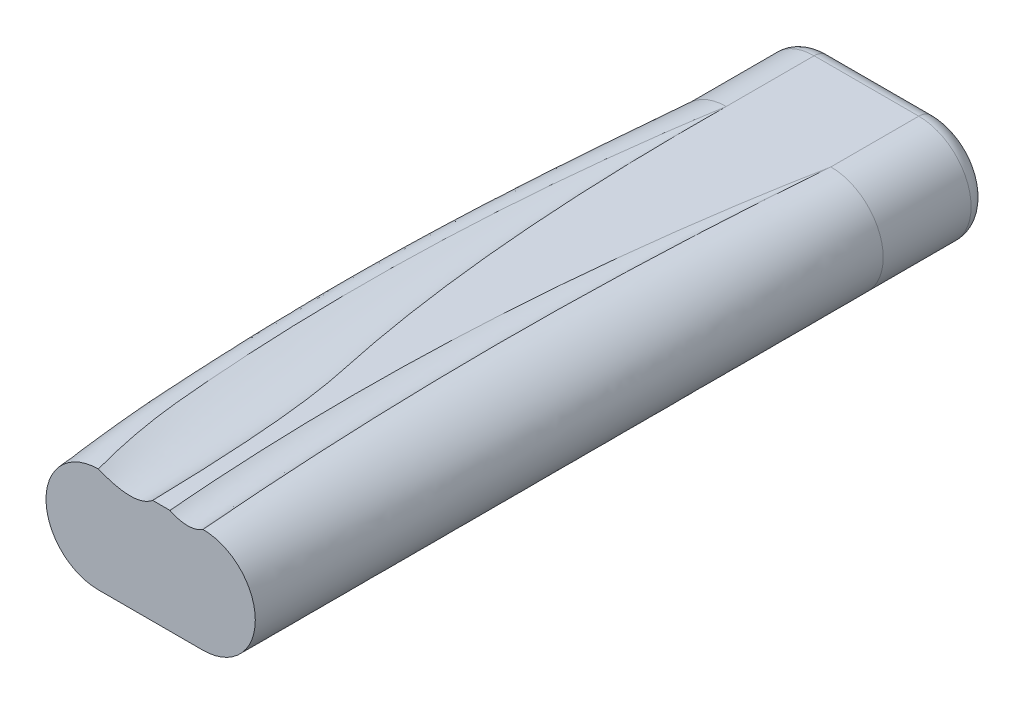
ISO-10303-21;
HEADER;
FILE_DESCRIPTION(('STEP AP214'),'2;1');
FILE_NAME('part.step','',(''),(''),'','','');
FILE_SCHEMA(('AUTOMOTIVE_DESIGN { 1 0 10303 214 1 1 1 1 }'));
ENDSEC;
DATA;
#1=APPLICATION_CONTEXT('core data for automotive mechanical design processes');
#2=APPLICATION_PROTOCOL_DEFINITION('international standard','automotive_design',2000,#1);
#3=PRODUCT_CONTEXT('',#1,'mechanical');
#4=PRODUCT('Part','Part','',(#3));
#5=PRODUCT_RELATED_PRODUCT_CATEGORY('part','',(#4));
#6=PRODUCT_DEFINITION_FORMATION('','',#4);
#7=PRODUCT_DEFINITION_CONTEXT('part definition',#1,'design');
#8=PRODUCT_DEFINITION('design','',#6,#7);
#9=PRODUCT_DEFINITION_SHAPE('','',#8);
#10=(LENGTH_UNIT() NAMED_UNIT(*) SI_UNIT(.MILLI.,.METRE.));
#11=(NAMED_UNIT(*) PLANE_ANGLE_UNIT() SI_UNIT($,.RADIAN.));
#12=(NAMED_UNIT(*) SI_UNIT($,.STERADIAN.) SOLID_ANGLE_UNIT());
#13=UNCERTAINTY_MEASURE_WITH_UNIT(LENGTH_MEASURE(1.E-05),#10,'distance_accuracy_value','');
#14=(GEOMETRIC_REPRESENTATION_CONTEXT(3) GLOBAL_UNCERTAINTY_ASSIGNED_CONTEXT((#13)) GLOBAL_UNIT_ASSIGNED_CONTEXT((#10,
#11,#12)) REPRESENTATION_CONTEXT('',''));
#15=CARTESIAN_POINT('',(0.,0.,0.));
#16=DIRECTION('',(0.,0.,1.));
#17=DIRECTION('',(1.,0.,0.));
#18=AXIS2_PLACEMENT_3D('',#15,#16,#17);
#19=CARTESIAN_POINT('',(-5.91221735905741,10.7831176583811,150.));
#20=DIRECTION('',(0.,0.,-1.));
#21=DIRECTION('',(-1.,0.,0.));
#22=AXIS2_PLACEMENT_3D('',#19,#20,#21);
#23=PLANE('',#22);
#24=CARTESIAN_POINT('',(0.474153099590674,12.5,150.));
#25=CARTESIAN_POINT('',(-3.21583822778807,9.48098458530452,150.));
#26=CARTESIAN_POINT('',(-8.54145909622858,10.9406625037117,150.));
#27=CARTESIAN_POINT('',(-12.5,12.5,150.));
#28=B_SPLINE_CURVE_WITH_KNOTS('',3,(#24,#25,#26,#27),.UNSPECIFIED.,.F.,.F.,(4,4),(0.,1.),.UNSPECIFIED.);
#29=CARTESIAN_POINT('',(0.474153099590674,12.5,150.));
#30=VERTEX_POINT('',#29);
#31=CARTESIAN_POINT('',(-12.5,12.5,150.));
#32=VERTEX_POINT('',#31);
#33=EDGE_CURVE('E255',#30,#32,#28,.T.);
#34=ORIENTED_EDGE('',*,*,#33,.T.);
#35=CARTESIAN_POINT('',(-12.5,0.,150.));
#36=DIRECTION('',(0.,0.,1.));
#37=DIRECTION('',(1.,0.,0.));
#38=AXIS2_PLACEMENT_3D('',#35,#36,#37);
#39=CIRCLE('',#38,12.5);
#40=CARTESIAN_POINT('',(-12.5,-12.5,150.));
#41=VERTEX_POINT('',#40);
#42=EDGE_CURVE('E286',#32,#41,#39,.T.);
#43=ORIENTED_EDGE('',*,*,#42,.T.);
#44=DIRECTION('',(1.,0.,0.));
#45=VECTOR('',#44,1.);
#46=CARTESIAN_POINT('',(-12.5,-12.5,150.));
#47=LINE('',#46,#45);
#48=CARTESIAN_POINT('',(12.5,-12.5,150.));
#49=VERTEX_POINT('',#48);
#50=EDGE_CURVE('E373',#41,#49,#47,.T.);
#51=ORIENTED_EDGE('',*,*,#50,.T.);
#52=CARTESIAN_POINT('',(12.5,0.,150.));
#53=DIRECTION('',(0.,0.,1.));
#54=DIRECTION('',(1.,0.,0.));
#55=AXIS2_PLACEMENT_3D('',#52,#53,#54);
#56=CIRCLE('',#55,12.5);
#57=CARTESIAN_POINT('',(12.5,12.5,150.));
#58=VERTEX_POINT('',#57);
#59=EDGE_CURVE('E363',#49,#58,#56,.T.);
#60=ORIENTED_EDGE('',*,*,#59,.T.);
#61=CARTESIAN_POINT('',(12.5,12.5,150.));
#62=CARTESIAN_POINT('',(10.190645501887,10.9194985123299,150.));
#63=CARTESIAN_POINT('',(6.97699935026828,11.2697294373195,150.));
#64=CARTESIAN_POINT('',(4.5992289890089,12.5,150.));
#65=B_SPLINE_CURVE_WITH_KNOTS('',3,(#61,#62,#63,#64),.UNSPECIFIED.,.F.,.F.,(4,4),(0.,1.),.UNSPECIFIED.);
#66=CARTESIAN_POINT('',(4.5992289890089,12.5,150.));
#67=VERTEX_POINT('',#66);
#68=EDGE_CURVE('E471',#58,#67,#65,.T.);
#69=ORIENTED_EDGE('',*,*,#68,.T.);
#70=DIRECTION('',(-1.,0.,0.));
#71=VECTOR('',#70,1.);
#72=CARTESIAN_POINT('',(0.474153099590674,12.5,150.));
#73=LINE('',#72,#71);
#74=EDGE_CURVE('E463',#67,#30,#73,.T.);
#75=ORIENTED_EDGE('',*,*,#74,.T.);
#76=EDGE_LOOP('',(#34,#43,#51,#60,#69,#75));
#77=FACE_BOUND('',#76,.T.);
#78=ADVANCED_FACE('F175',(#77),#23,.F.);
#79=CARTESIAN_POINT('',(12.5,12.5,150.));
#80=CARTESIAN_POINT('',(11.8126335312723,12.5,141.869479536742));
#81=CARTESIAN_POINT('',(11.2370034869234,12.5,133.73939089077));
#82=CARTESIAN_POINT('',(10.453008443718,12.5,120.000011036705));
#83=CARTESIAN_POINT('',(10.1861096601622,12.5,114.390493618579));
#84=CARTESIAN_POINT('',(8.59068550282614,12.5,72.5121919948681));
#85=CARTESIAN_POINT('',(9.43321433073099,12.5,36.2517980589654));
#86=CARTESIAN_POINT('',(12.5,12.5,0.));
#87=CARTESIAN_POINT('',(14.1362461630983,12.5,150.));
#88=CARTESIAN_POINT('',(13.4488796943706,12.5,141.869479536742));
#89=CARTESIAN_POINT('',(12.8732496500216,12.5,133.73939089077));
#90=CARTESIAN_POINT('',(12.0892546068163,12.5,120.000011036705));
#91=CARTESIAN_POINT('',(11.8223558232604,12.5,114.390493618579));
#92=CARTESIAN_POINT('',(10.2269316659244,12.5,72.5121919948681));
#93=CARTESIAN_POINT('',(11.0694604938293,12.5,36.2517980589654));
#94=CARTESIAN_POINT('',(14.1362461630983,12.5,0.));
#95=CARTESIAN_POINT('',(17.4082063041054,11.8498717823981,150.));
#96=CARTESIAN_POINT('',(16.8067606439687,11.8498717823981,141.869811586838));
#97=CARTESIAN_POINT('',(16.3030843551633,11.8498717823981,133.740001013801));
#98=CARTESIAN_POINT('',(15.6170886923586,11.8498717823981,120.000999888755));
#99=CARTESIAN_POINT('',(15.3835522567472,11.8498717823981,114.391611402969));
#100=CARTESIAN_POINT('',(13.9875561190782,11.8498717823981,72.5140804900332));
#101=CARTESIAN_POINT('',(14.724768843495,11.8498717823981,36.2532795488566));
#102=CARTESIAN_POINT('',(17.4082063041053,11.8498717823981,0.));
#103=CARTESIAN_POINT('',(21.5691455420025,9.06914554200246,150.));
#104=CARTESIAN_POINT('',(21.2254623076386,9.06914554200246,141.870807737125));
#105=CARTESIAN_POINT('',(20.9376472854642,9.06914554200246,133.741831382893));
#106=CARTESIAN_POINT('',(20.5456497638615,9.06914554200246,120.003966444907));
#107=CARTESIAN_POINT('',(20.4122003720835,9.06914554200246,114.394964756138));
#108=CARTESIAN_POINT('',(19.6144882934155,9.06914554200246,72.5197459755285));
#109=CARTESIAN_POINT('',(20.035752707368,9.06914554200246,36.25772401853));
#110=CARTESIAN_POINT('',(21.5691455420025,9.06914554200245,0.));
#111=CARTESIAN_POINT('',(24.3498717823981,4.90820630410531,150.));
#112=CARTESIAN_POINT('',(24.2639509738071,4.90820630410531,141.871803887412));
#113=CARTESIAN_POINT('',(24.1919972182635,4.90820630410531,133.743661751984));
#114=CARTESIAN_POINT('',(24.0939978378628,4.90820630410531,120.006933001059));
#115=CARTESIAN_POINT('',(24.0606354899184,4.90820630410531,114.398318109307));
#116=CARTESIAN_POINT('',(23.8612074702513,4.90820630410531,72.5254114610238));
#117=CARTESIAN_POINT('',(23.9665235737395,4.90820630410531,36.2621684882034));
#118=CARTESIAN_POINT('',(24.3498717823981,4.90820630410532,0.));
#119=CARTESIAN_POINT('',(25.,1.63624616309826,150.));
#120=CARTESIAN_POINT('',(25.,1.63624616309826,141.872135937508));
#121=CARTESIAN_POINT('',(25.,1.63624616309826,133.744271875015));
#122=CARTESIAN_POINT('',(25.,1.63624616309826,120.00792185311));
#123=CARTESIAN_POINT('',(25.,1.63624616309826,114.399435893697));
#124=CARTESIAN_POINT('',(25.,1.63624616309826,72.527299956189));
#125=CARTESIAN_POINT('',(25.,1.63624616309826,36.2636499780945));
#126=CARTESIAN_POINT('',(25.,1.63624616309826,0.));
#127=CARTESIAN_POINT('',(25.,-1.63624616309826,150.));
#128=CARTESIAN_POINT('',(25.,-1.63624616309826,141.872135937508));
#129=CARTESIAN_POINT('',(25.,-1.63624616309826,133.744271875015));
#130=CARTESIAN_POINT('',(25.,-1.63624616309826,120.00792185311));
#131=CARTESIAN_POINT('',(25.,-1.63624616309826,114.399435893697));
#132=CARTESIAN_POINT('',(25.,-1.63624616309826,72.527299956189));
#133=CARTESIAN_POINT('',(25.,-1.63624616309826,36.2636499780945));
#134=CARTESIAN_POINT('',(25.,-1.63624616309826,0.));
#135=CARTESIAN_POINT('',(24.3498717823982,-4.90820630410533,150.));
#136=CARTESIAN_POINT('',(24.3498717823982,-4.90820630410533,141.872135937508));
#137=CARTESIAN_POINT('',(24.3498717823982,-4.90820630410533,133.744271875015));
#138=CARTESIAN_POINT('',(24.3498717823981,-4.90820630410533,120.00792185311));
#139=CARTESIAN_POINT('',(24.3498717823981,-4.90820630410533,114.399435893697));
#140=CARTESIAN_POINT('',(24.3498717823981,-4.90820630410532,72.5272999561892));
#141=CARTESIAN_POINT('',(24.3498717823981,-4.90820630410532,36.2636499780946));
#142=CARTESIAN_POINT('',(24.3498717823981,-4.90820630410532,0.));
#143=CARTESIAN_POINT('',(21.5691455420024,-9.06914554200244,150.));
#144=CARTESIAN_POINT('',(21.5691455420024,-9.06914554200245,141.872135937507));
#145=CARTESIAN_POINT('',(21.5691455420024,-9.06914554200245,133.744271875015));
#146=CARTESIAN_POINT('',(21.5691455420024,-9.06914554200245,120.007921853109));
#147=CARTESIAN_POINT('',(21.5691455420024,-9.06914554200245,114.399435893696));
#148=CARTESIAN_POINT('',(21.5691455420024,-9.06914554200245,72.5272999561889));
#149=CARTESIAN_POINT('',(21.5691455420024,-9.06914554200246,36.2636499780944));
#150=CARTESIAN_POINT('',(21.5691455420025,-9.06914554200246,0.));
#151=CARTESIAN_POINT('',(17.4082063041054,-11.8498717823981,150.));
#152=CARTESIAN_POINT('',(17.4082063041054,-11.8498717823981,141.872135937508));
#153=CARTESIAN_POINT('',(17.4082063041054,-11.8498717823981,133.744271875015));
#154=CARTESIAN_POINT('',(17.4082063041053,-11.8498717823981,120.00792185311));
#155=CARTESIAN_POINT('',(17.4082063041053,-11.8498717823981,114.399435893697));
#156=CARTESIAN_POINT('',(17.4082063041053,-11.8498717823981,72.5272999561891));
#157=CARTESIAN_POINT('',(17.4082063041053,-11.8498717823981,36.2636499780945));
#158=CARTESIAN_POINT('',(17.4082063041053,-11.8498717823981,0.));
#159=CARTESIAN_POINT('',(14.1362461630983,-12.5,150.));
#160=CARTESIAN_POINT('',(14.1362461630983,-12.5,141.872135937508));
#161=CARTESIAN_POINT('',(14.1362461630983,-12.5,133.744271875015));
#162=CARTESIAN_POINT('',(14.1362461630983,-12.5,120.00792185311));
#163=CARTESIAN_POINT('',(14.1362461630983,-12.5,114.399435893697));
#164=CARTESIAN_POINT('',(14.1362461630983,-12.5,72.527299956189));
#165=CARTESIAN_POINT('',(14.1362461630983,-12.5,36.2636499780945));
#166=CARTESIAN_POINT('',(14.1362461630983,-12.5,0.));
#167=CARTESIAN_POINT('',(10.4166666666667,-12.5,150.));
#168=CARTESIAN_POINT('',(10.4166666666667,-12.5,141.872135937508));
#169=CARTESIAN_POINT('',(10.4166666666667,-12.5,133.744271875015));
#170=CARTESIAN_POINT('',(10.4166666666667,-12.5,120.00792185311));
#171=CARTESIAN_POINT('',(10.4166666666667,-12.5,114.399435893697));
#172=CARTESIAN_POINT('',(10.4166666666667,-12.5,72.527299956189));
#173=CARTESIAN_POINT('',(10.4166666666667,-12.5,36.2636499780945));
#174=CARTESIAN_POINT('',(10.4166666666667,-12.5,0.));
#175=CARTESIAN_POINT('',(6.25000000000001,-12.5,150.));
#176=CARTESIAN_POINT('',(6.25000000000001,-12.5,141.872135937508));
#177=CARTESIAN_POINT('',(6.25000000000001,-12.5,133.744271875015));
#178=CARTESIAN_POINT('',(6.25,-12.5,120.00792185311));
#179=CARTESIAN_POINT('',(6.25,-12.5,114.399435893697));
#180=CARTESIAN_POINT('',(6.25,-12.5,72.527299956189));
#181=CARTESIAN_POINT('',(6.25,-12.5,36.2636499780945));
#182=CARTESIAN_POINT('',(6.25,-12.5,0.));
#183=CARTESIAN_POINT('',(0.,-12.5,150.));
#184=CARTESIAN_POINT('',(0.,-12.5,141.872135937508));
#185=CARTESIAN_POINT('',(0.,-12.5,133.744271875015));
#186=CARTESIAN_POINT('',(0.,-12.5,120.00792185311));
#187=CARTESIAN_POINT('',(0.,-12.5,114.399435893697));
#188=CARTESIAN_POINT('',(0.,-12.5,72.5272999561891));
#189=CARTESIAN_POINT('',(0.,-12.5,36.2636499780945));
#190=CARTESIAN_POINT('',(0.,-12.5,0.));
#191=CARTESIAN_POINT('',(-6.25,-12.5,150.));
#192=CARTESIAN_POINT('',(-6.25,-12.5,141.872135937507));
#193=CARTESIAN_POINT('',(-6.25,-12.5,133.744271875015));
#194=CARTESIAN_POINT('',(-6.25,-12.5,120.00792185311));
#195=CARTESIAN_POINT('',(-6.25,-12.5,114.399435893696));
#196=CARTESIAN_POINT('',(-6.25,-12.5,72.527299956189));
#197=CARTESIAN_POINT('',(-6.25,-12.5,36.2636499780945));
#198=CARTESIAN_POINT('',(-6.24999999999999,-12.5,0.));
#199=CARTESIAN_POINT('',(-10.4166666666667,-12.5,150.));
#200=CARTESIAN_POINT('',(-10.4166666666667,-12.5,141.872135937508));
#201=CARTESIAN_POINT('',(-10.4166666666667,-12.5,133.744271875015));
#202=CARTESIAN_POINT('',(-10.4166666666667,-12.5,120.00792185311));
#203=CARTESIAN_POINT('',(-10.4166666666667,-12.5,114.399435893697));
#204=CARTESIAN_POINT('',(-10.4166666666667,-12.5,72.527299956189));
#205=CARTESIAN_POINT('',(-10.4166666666667,-12.5,36.2636499780945));
#206=CARTESIAN_POINT('',(-10.4166666666667,-12.5,0.));
#207=CARTESIAN_POINT('',(-14.1362461630983,-12.5,150.));
#208=CARTESIAN_POINT('',(-14.1362461630983,-12.5,141.872135937508));
#209=CARTESIAN_POINT('',(-14.1362461630983,-12.5,133.744271875015));
#210=CARTESIAN_POINT('',(-14.1362461630983,-12.5,120.00792185311));
#211=CARTESIAN_POINT('',(-14.1362461630983,-12.5,114.399435893697));
#212=CARTESIAN_POINT('',(-14.1362461630983,-12.5,72.527299956189));
#213=CARTESIAN_POINT('',(-14.1362461630983,-12.5,36.2636499780945));
#214=CARTESIAN_POINT('',(-14.1362461630983,-12.5,0.));
#215=CARTESIAN_POINT('',(-17.4082063041054,-11.8498717823981,150.));
#216=CARTESIAN_POINT('',(-17.4082063041054,-11.8498717823981,141.872135937508));
#217=CARTESIAN_POINT('',(-17.4082063041054,-11.8498717823981,133.744271875015));
#218=CARTESIAN_POINT('',(-17.4082063041054,-11.8498717823981,120.00792185311));
#219=CARTESIAN_POINT('',(-17.4082063041054,-11.8498717823981,114.399435893697));
#220=CARTESIAN_POINT('',(-17.4082063041053,-11.8498717823981,72.527299956189));
#221=CARTESIAN_POINT('',(-17.4082063041053,-11.8498717823981,36.2636499780945));
#222=CARTESIAN_POINT('',(-17.4082063041053,-11.8498717823981,0.));
#223=CARTESIAN_POINT('',(-21.5691455420024,-9.06914554200247,150.));
#224=CARTESIAN_POINT('',(-21.5691455420024,-9.06914554200247,141.872135937507));
#225=CARTESIAN_POINT('',(-21.5691455420024,-9.06914554200247,133.744271875015));
#226=CARTESIAN_POINT('',(-21.5691455420024,-9.06914554200247,120.007921853109));
#227=CARTESIAN_POINT('',(-21.5691455420024,-9.06914554200247,114.399435893696));
#228=CARTESIAN_POINT('',(-21.5691455420025,-9.06914554200247,72.5272999561889));
#229=CARTESIAN_POINT('',(-21.5691455420025,-9.06914554200246,36.2636499780945));
#230=CARTESIAN_POINT('',(-21.5691455420025,-9.06914554200246,0.));
#231=CARTESIAN_POINT('',(-24.3498717823981,-4.9082063041053,150.));
#232=CARTESIAN_POINT('',(-24.3498717823981,-4.9082063041053,141.872135937508));
#233=CARTESIAN_POINT('',(-24.3498717823981,-4.9082063041053,133.744271875015));
#234=CARTESIAN_POINT('',(-24.3498717823981,-4.9082063041053,120.00792185311));
#235=CARTESIAN_POINT('',(-24.3498717823981,-4.9082063041053,114.399435893697));
#236=CARTESIAN_POINT('',(-24.3498717823981,-4.90820630410531,72.5272999561891));
#237=CARTESIAN_POINT('',(-24.3498717823981,-4.90820630410531,36.2636499780945));
#238=CARTESIAN_POINT('',(-24.349871782398,-4.90820630410532,0.));
#239=CARTESIAN_POINT('',(-25.,-1.63624616309826,150.));
#240=CARTESIAN_POINT('',(-25.,-1.63624616309826,141.872135937508));
#241=CARTESIAN_POINT('',(-25.,-1.63624616309826,133.744271875015));
#242=CARTESIAN_POINT('',(-25.,-1.63624616309826,120.00792185311));
#243=CARTESIAN_POINT('',(-25.,-1.63624616309826,114.399435893697));
#244=CARTESIAN_POINT('',(-25.,-1.63624616309826,72.527299956189));
#245=CARTESIAN_POINT('',(-25.,-1.63624616309826,36.2636499780945));
#246=CARTESIAN_POINT('',(-25.,-1.63624616309826,0.));
#247=CARTESIAN_POINT('',(-25.,1.63624616309825,150.));
#248=CARTESIAN_POINT('',(-25.,1.63624616309825,141.872135937508));
#249=CARTESIAN_POINT('',(-25.,1.63624616309825,133.744271875015));
#250=CARTESIAN_POINT('',(-25.,1.63624616309825,120.00792185311));
#251=CARTESIAN_POINT('',(-25.,1.63624616309825,114.399435893697));
#252=CARTESIAN_POINT('',(-25.,1.63624616309826,72.527299956189));
#253=CARTESIAN_POINT('',(-25.,1.63624616309826,36.2636499780945));
#254=CARTESIAN_POINT('',(-25.,1.63624616309826,0.));
#255=CARTESIAN_POINT('',(-24.3498717823981,4.9082063041053,150.));
#256=CARTESIAN_POINT('',(-24.6336574691777,4.9082063041053,141.862781958882));
#257=CARTESIAN_POINT('',(-24.8222787925575,4.9082063041053,133.732727190063));
#258=CARTESIAN_POINT('',(-24.9802240416903,4.9082063041053,120.00478096357));
#259=CARTESIAN_POINT('',(-25.0326905544805,4.9082063041053,114.399305946857));
#260=CARTESIAN_POINT('',(-25.3346450416466,4.90820630410531,72.546511467878));
#261=CARTESIAN_POINT('',(-25.0935572054766,4.90820630410531,36.2820412534094));
#262=CARTESIAN_POINT('',(-24.3498717823981,4.90820630410532,0.));
#263=CARTESIAN_POINT('',(-21.5691455420024,9.06914554200247,150.));
#264=CARTESIAN_POINT('',(-22.7042882891208,9.06914554200247,141.834720023006));
#265=CARTESIAN_POINT('',(-23.4587735826399,9.06914554200247,133.698093135209));
#266=CARTESIAN_POINT('',(-24.0905545791711,9.06914554200247,119.995358294953));
#267=CARTESIAN_POINT('',(-24.300420630332,9.06914554200247,114.39891610634));
#268=CARTESIAN_POINT('',(-25.5082385789966,9.06914554200246,72.6041460029453));
#269=CARTESIAN_POINT('',(-24.5438872343166,9.06914554200246,36.3372150793542));
#270=CARTESIAN_POINT('',(-21.5691455420025,9.06914554200246,0.));
#271=CARTESIAN_POINT('',(-17.4082063041054,11.8498717823981,150.));
#272=CARTESIAN_POINT('',(-19.3947061115626,11.8498717823981,141.806658087129));
#273=CARTESIAN_POINT('',(-20.715055375221,11.8498717823981,133.663459080355));
#274=CARTESIAN_POINT('',(-21.8206721191506,11.8498717823981,119.985935626334));
#275=CARTESIAN_POINT('',(-22.1879377086821,11.8498717823981,114.398526265822));
#276=CARTESIAN_POINT('',(-24.3016191188451,11.8498717823981,72.6617805380124));
#277=CARTESIAN_POINT('',(-22.6140042656551,11.8498717823981,36.3923889052989));
#278=CARTESIAN_POINT('',(-17.4082063041053,11.8498717823981,0.));
#279=CARTESIAN_POINT('',(-14.1362461630983,12.5,150.));
#280=CARTESIAN_POINT('',(-16.4065316573351,12.5,141.797304108504));
#281=CARTESIAN_POINT('',(-17.9155022443733,12.5,133.651914395403));
#282=CARTESIAN_POINT('',(-19.1790642374356,12.5,119.982794736795));
#283=CARTESIAN_POINT('',(-19.5987963397574,12.5,114.398396318983));
#284=CARTESIAN_POINT('',(-22.0144322370865,12.5,72.6809920497015));
#285=CARTESIAN_POINT('',(-20.0857295477266,12.5,36.4107801806139));
#286=CARTESIAN_POINT('',(-14.1362461630983,12.5,0.));
#287=CARTESIAN_POINT('',(-12.5,12.5,150.));
#288=CARTESIAN_POINT('',(-14.7702854942368,12.5,141.797304108504));
#289=CARTESIAN_POINT('',(-16.2792560812751,12.5,133.651914395403));
#290=CARTESIAN_POINT('',(-17.5428180743374,12.5,119.982794736795));
#291=CARTESIAN_POINT('',(-17.9625501766591,12.5,114.398396318983));
#292=CARTESIAN_POINT('',(-20.3781860739883,12.5,72.6809920497015));
#293=CARTESIAN_POINT('',(-18.4494833846283,12.5,36.4107801806139));
#294=CARTESIAN_POINT('',(-12.5,12.5,0.));
#295=B_SPLINE_SURFACE_WITH_KNOTS('',3,3,((#79,#80,#81,#82,#83,#84,#85,#86),(#87,#88,#89,#90,#91,
#92,#93,#94),(#95,#96,#97,#98,#99,#100,#101,#102),(#103,#104,#105,#106,#107,#108,#109,#110),
(#111,#112,#113,#114,#115,#116,#117,#118),(#119,#120,#121,#122,#123,#124,#125,#126),(#127,#128,
#129,#130,#131,#132,#133,#134),(#135,#136,#137,#138,#139,#140,#141,#142),(#143,#144,#145,#146,
#147,#148,#149,#150),(#151,#152,#153,#154,#155,#156,#157,#158),(#159,#160,#161,#162,#163,#164,
#165,#166),(#167,#168,#169,#170,#171,#172,#173,#174),(#175,#176,#177,#178,#179,#180,#181,#182),
(#183,#184,#185,#186,#187,#188,#189,#190),(#191,#192,#193,#194,#195,#196,#197,#198),(#199,#200,
#201,#202,#203,#204,#205,#206),(#207,#208,#209,#210,#211,#212,#213,#214),(#215,#216,#217,#218,
#219,#220,#221,#222),(#223,#224,#225,#226,#227,#228,#229,#230),(#231,#232,#233,#234,#235,#236,
#237,#238),(#239,#240,#241,#242,#243,#244,#245,#246),(#247,#248,#249,#250,#251,#252,#253,#254),
(#255,#256,#257,#258,#259,#260,#261,#262),(#263,#264,#265,#266,#267,#268,#269,#270),(#271,#272,
#273,#274,#275,#276,#277,#278),(#279,#280,#281,#282,#283,#284,#285,#286),(#287,#288,#289,#290,
#291,#292,#293,#294)),.UNSPECIFIED.,.F.,.F.,.F.,(4,1,1,1,2,1,1,1,2,1,1,1,2,1,1,1,2,1,1,1,4),(4,
2,2,4),(0.,0.0474091870621735,0.094818374124347,0.142227561186521,0.189636748248694,
0.237045935310867,0.284455122373041,0.331864309435215,0.379273496497388,0.439636748248694,0.5,
0.560363251751306,0.620726503502612,0.668135690564786,0.715544877626959,0.762954064689133,
0.810363251751306,0.85777243881348,0.905181625875653,0.952590812937827,1.),(0.,
0.162557281249849,0.27472700043811,1.),.UNSPECIFIED.);
#296=CARTESIAN_POINT('',(-12.5,12.5,150.));
#297=CARTESIAN_POINT('',(-14.7702854942368,12.5,141.797304108504));
#298=CARTESIAN_POINT('',(-16.2792560812751,12.5,133.651914395403));
#299=CARTESIAN_POINT('',(-17.5428180743374,12.5,119.982794736795));
#300=CARTESIAN_POINT('',(-17.9625501766591,12.5,114.398396318983));
#301=CARTESIAN_POINT('',(-20.3781860739883,12.5,72.6809920497015));
#302=CARTESIAN_POINT('',(-18.4494833846283,12.5,36.4107801806139));
#303=CARTESIAN_POINT('',(-12.5,12.5,0.));
#304=B_SPLINE_CURVE_WITH_KNOTS('',3,(#296,#297,#298,#299,#300,#301,#302,#303),.UNSPECIFIED.,.F.,
.F.,(4,2,2,4),(0.,0.162557281249849,0.27472700043811,1.),.UNSPECIFIED.);
#305=CARTESIAN_POINT('',(-12.5,12.5,0.));
#306=VERTEX_POINT('',#305);
#307=EDGE_CURVE('E277',#32,#306,#304,.T.);
#308=CARTESIAN_POINT('',(-12.5,0.,0.));
#309=DIRECTION('',(0.,0.,1.));
#310=DIRECTION('',(1.,0.,0.));
#311=AXIS2_PLACEMENT_3D('',#308,#309,#310);
#312=CIRCLE('',#311,12.5);
#313=CARTESIAN_POINT('',(-12.5,-12.5,0.));
#314=VERTEX_POINT('',#313);
#315=EDGE_CURVE('E259',#306,#314,#312,.T.);
#316=DIRECTION('',(1.,0.,0.));
#317=VECTOR('',#316,1.);
#318=CARTESIAN_POINT('',(-12.5,-12.5,0.));
#319=LINE('',#318,#317);
#320=CARTESIAN_POINT('',(12.5,-12.5,0.));
#321=VERTEX_POINT('',#320);
#322=EDGE_CURVE('E270',#314,#321,#319,.T.);
#323=CARTESIAN_POINT('',(12.5,0.,0.));
#324=DIRECTION('',(0.,0.,1.));
#325=DIRECTION('',(1.,0.,0.));
#326=AXIS2_PLACEMENT_3D('',#323,#324,#325);
#327=CIRCLE('',#326,12.5);
#328=CARTESIAN_POINT('',(12.5,12.5,0.));
#329=VERTEX_POINT('',#328);
#330=EDGE_CURVE('E385',#321,#329,#327,.T.);
#331=CARTESIAN_POINT('',(12.5,12.5,150.));
#332=CARTESIAN_POINT('',(11.8126335312723,12.5,141.869479536742));
#333=CARTESIAN_POINT('',(11.2370034869234,12.5,133.73939089077));
#334=CARTESIAN_POINT('',(10.453008443718,12.5,120.000011036705));
#335=CARTESIAN_POINT('',(10.1861096601622,12.5,114.390493618579));
#336=CARTESIAN_POINT('',(8.59068550282614,12.5,72.5121919948681));
#337=CARTESIAN_POINT('',(9.43321433073099,12.5,36.2517980589654));
#338=CARTESIAN_POINT('',(12.5,12.5,0.));
#339=B_SPLINE_CURVE_WITH_KNOTS('',3,(#331,#332,#333,#334,#335,#336,#337,#338),.UNSPECIFIED.,.F.,
.F.,(4,2,2,4),(0.,0.162557281249849,0.27472700043811,1.),.UNSPECIFIED.);
#340=EDGE_CURVE('E289',#329,#58,#339,.F.);
#341=ORIENTED_EDGE('',*,*,#59,.F.);
#342=ORIENTED_EDGE('',*,*,#50,.F.);
#343=ORIENTED_EDGE('',*,*,#42,.F.);
#344=ORIENTED_EDGE('',*,*,#307,.T.);
#345=ORIENTED_EDGE('',*,*,#315,.T.);
#346=ORIENTED_EDGE('',*,*,#322,.T.);
#347=ORIENTED_EDGE('',*,*,#330,.T.);
#348=ORIENTED_EDGE('',*,*,#340,.T.);
#349=EDGE_LOOP('',(#341,#342,#343,#344,#345,#346,#347,#348));
#350=FACE_BOUND('',#349,.T.);
#351=ADVANCED_FACE('F284',(#350),#295,.T.);
#352=CARTESIAN_POINT('',(-12.5,12.5,150.));
#353=CARTESIAN_POINT('',(-14.7702854942368,12.5,141.797304108504));
#354=CARTESIAN_POINT('',(-16.2792560812751,12.5,133.651914395403));
#355=CARTESIAN_POINT('',(-17.5428180743374,12.5,119.982794736795));
#356=CARTESIAN_POINT('',(-17.9625501766591,12.5,114.398396318983));
#357=CARTESIAN_POINT('',(-20.3781860739883,12.5,72.6809920497015));
#358=CARTESIAN_POINT('',(-18.4494833846283,12.5,36.4107801806139));
#359=CARTESIAN_POINT('',(-12.5,12.5,0.));
#360=CARTESIAN_POINT('',(-8.54145909622858,10.9406625037117,150.));
#361=CARTESIAN_POINT('',(-10.1279877750606,11.0251563916942,140.126008887534));
#362=CARTESIAN_POINT('',(-11.3165153367196,11.1096502796767,130.968502540173));
#363=CARTESIAN_POINT('',(-12.65253029213,11.2524476506854,116.702906301747));
#364=CARTESIAN_POINT('',(-13.1860605133687,11.3107511337115,111.199049446895));
#365=CARTESIAN_POINT('',(-17.0800402749695,11.7460364111584,72.5024913021036));
#366=CARTESIAN_POINT('',(-16.6774961266623,12.1230182055792,37.1638545043174));
#367=CARTESIAN_POINT('',(-12.5,12.5,0.));
#368=CARTESIAN_POINT('',(-3.21583822778807,9.48098458530452,150.));
#369=CARTESIAN_POINT('',(-4.19268635865118,9.64457223125929,138.454713666565));
#370=CARTESIAN_POINT('',(-5.13484716236691,9.80815987721405,128.285090684943));
#371=CARTESIAN_POINT('',(-6.66850633947622,10.0846282269326,113.4230178667));
#372=CARTESIAN_POINT('',(-7.3669496715468,10.1975089306964,107.999702574806));
#373=CARTESIAN_POINT('',(-13.1208903515398,11.0402597563068,72.3239905545057));
#374=CARTESIAN_POINT('',(-14.5750068064908,11.7701298781534,37.916928828021));
#375=CARTESIAN_POINT('',(-12.5,12.5,0.));
#376=CARTESIAN_POINT('',(0.474153099590674,12.5,150.));
#377=CARTESIAN_POINT('',(0.195613347138788,12.5,136.783418445595));
#378=CARTESIAN_POINT('',(-0.411552868191351,12.5,125.601678829713));
#379=CARTESIAN_POINT('',(-1.99307240111831,12.5,110.143129431652));
#380=CARTESIAN_POINT('',(-2.7952728085818,12.5,104.800355702717));
#381=CARTESIAN_POINT('',(-9.9525923903886,12.5,72.1454898069077));
#382=CARTESIAN_POINT('',(-12.8679434674585,12.5,38.6700031517245));
#383=CARTESIAN_POINT('',(-12.5,12.5,0.));
#384=B_SPLINE_SURFACE_WITH_KNOTS('',3,3,((#352,#353,#354,#355,#356,#357,#358,#359),(#360,#361,
#362,#363,#364,#365,#366,#367),(#368,#369,#370,#371,#372,#373,#374,#375),(#376,#377,#378,#379,
#380,#381,#382,#383)),.UNSPECIFIED.,.F.,.F.,.F.,(4,4),(4,2,2,4),(0.,1.),(0.,0.162557281249849,
0.27472700043811,1.),.UNSPECIFIED.);
#385=CARTESIAN_POINT('',(0.474153099590674,12.5,150.));
#386=CARTESIAN_POINT('',(0.195613347138788,12.5,136.783418445595));
#387=CARTESIAN_POINT('',(-0.411552868191351,12.5,125.601678829713));
#388=CARTESIAN_POINT('',(-1.99307240111831,12.5,110.143129431652));
#389=CARTESIAN_POINT('',(-2.7952728085818,12.5,104.800355702717));
#390=CARTESIAN_POINT('',(-9.9525923903886,12.5,72.1454898069077));
#391=CARTESIAN_POINT('',(-12.8679434674585,12.5,38.6700031517245));
#392=CARTESIAN_POINT('',(-12.5,12.5,0.));
#393=B_SPLINE_CURVE_WITH_KNOTS('',3,(#385,#386,#387,#388,#389,#390,#391,#392),.UNSPECIFIED.,.F.,
.F.,(4,2,2,4),(0.,0.162557281249849,0.27472700043811,1.),.UNSPECIFIED.);
#394=EDGE_CURVE('E251',#30,#306,#393,.T.);
#395=ORIENTED_EDGE('',*,*,#33,.F.);
#396=ORIENTED_EDGE('',*,*,#394,.T.);
#397=ORIENTED_EDGE('',*,*,#307,.F.);
#398=EDGE_LOOP('',(#395,#396,#397));
#399=FACE_BOUND('',#398,.T.);
#400=ADVANCED_FACE('F276',(#399),#384,.T.);
#401=CARTESIAN_POINT('',(4.5992289890089,12.5,150.));
#402=CARTESIAN_POINT('',(3.9118519532207,12.5,141.818554304135));
#403=CARTESIAN_POINT('',(3.4058053410288,12.5,133.645818692917));
#404=CARTESIAN_POINT('',(2.85702460478204,12.5,119.848354641041));
#405=CARTESIAN_POINT('',(2.71929946921701,12.5,114.219063371188));
#406=CARTESIAN_POINT('',(2.33566117283438,12.5,72.2225608313498));
#407=CARTESIAN_POINT('',(5.61302325758834,12.5,36.0245877124215));
#408=CARTESIAN_POINT('',(12.5,12.5,0.));
#409=CARTESIAN_POINT('',(6.97699935026828,11.2697294373195,150.));
#410=CARTESIAN_POINT('',(6.3034876367487,11.3363925832765,141.835529381671));
#411=CARTESIAN_POINT('',(5.78810834708622,11.4030557292336,133.677009425535));
#412=CARTESIAN_POINT('',(5.18434972671545,11.5157185763711,119.898906772929));
#413=CARTESIAN_POINT('',(5.01313179343389,11.5617182775515,114.276206786985));
#414=CARTESIAN_POINT('',(4.29697640206424,11.9051453191547,72.3191045525225));
#415=CARTESIAN_POINT('',(6.82457384158553,12.2025726595773,36.1003244946028));
#416=CARTESIAN_POINT('',(12.5,12.5,0.));
#417=CARTESIAN_POINT('',(10.190645501887,10.9194985123299,150.));
#418=CARTESIAN_POINT('',(9.48570654532156,11.0051391872789,141.852504459207));
#419=CARTESIAN_POINT('',(8.91570201287402,11.0907798622279,133.708200158153));
#420=CARTESIAN_POINT('',(8.18041962550451,11.2355153398598,119.949458904817));
#421=CARTESIAN_POINT('',(7.94445557694612,11.2946101425426,114.333350202782));
#422=CARTESIAN_POINT('',(6.66245039245081,11.735803296817,72.4156482736953));
#423=CARTESIAN_POINT('',(8.23820380616107,12.1179016484085,36.1760612767841));
#424=CARTESIAN_POINT('',(12.5,12.5,0.));
#425=CARTESIAN_POINT('',(12.5,12.5,150.));
#426=CARTESIAN_POINT('',(11.8126335312723,12.5,141.869479536742));
#427=CARTESIAN_POINT('',(11.2370034869234,12.5,133.73939089077));
#428=CARTESIAN_POINT('',(10.453008443718,12.5,120.000011036705));
#429=CARTESIAN_POINT('',(10.1861096601622,12.5,114.390493618579));
#430=CARTESIAN_POINT('',(8.59068550282614,12.5,72.5121919948681));
#431=CARTESIAN_POINT('',(9.43321433073099,12.5,36.2517980589654));
#432=CARTESIAN_POINT('',(12.5,12.5,0.));
#433=B_SPLINE_SURFACE_WITH_KNOTS('',3,3,((#401,#402,#403,#404,#405,#406,#407,#408),(#409,#410,
#411,#412,#413,#414,#415,#416),(#417,#418,#419,#420,#421,#422,#423,#424),(#425,#426,#427,#428,
#429,#430,#431,#432)),.UNSPECIFIED.,.F.,.F.,.F.,(4,4),(4,2,2,4),(0.,1.),(0.,0.162557281249849,
0.27472700043811,1.),.UNSPECIFIED.);
#434=CARTESIAN_POINT('',(4.5992289890089,12.5,150.));
#435=CARTESIAN_POINT('',(3.9118519532207,12.5,141.818554304135));
#436=CARTESIAN_POINT('',(3.4058053410288,12.5,133.645818692917));
#437=CARTESIAN_POINT('',(2.85702460478204,12.5,119.848354641041));
#438=CARTESIAN_POINT('',(2.71929946921701,12.5,114.219063371188));
#439=CARTESIAN_POINT('',(2.33566117283438,12.5,72.2225608313498));
#440=CARTESIAN_POINT('',(5.61302325758834,12.5,36.0245877124215));
#441=CARTESIAN_POINT('',(12.5,12.5,0.));
#442=B_SPLINE_CURVE_WITH_KNOTS('',3,(#434,#435,#436,#437,#438,#439,#440,#441),.UNSPECIFIED.,.F.,
.F.,(4,2,2,4),(0.,0.162557281249849,0.27472700043811,1.),.UNSPECIFIED.);
#443=EDGE_CURVE('E271',#67,#329,#442,.T.);
#444=ORIENTED_EDGE('',*,*,#68,.F.);
#445=ORIENTED_EDGE('',*,*,#340,.F.);
#446=ORIENTED_EDGE('',*,*,#443,.F.);
#447=EDGE_LOOP('',(#444,#445,#446));
#448=FACE_BOUND('',#447,.T.);
#449=ADVANCED_FACE('F320',(#448),#433,.T.);
#450=CARTESIAN_POINT('',(0.474153099590674,12.5,150.));
#451=DIRECTION('',(0.,1.,0.));
#452=DIRECTION('',(1.,0.,0.));
#453=AXIS2_PLACEMENT_3D('',#450,#451,#452);
#454=PLANE('',#453);
#455=DIRECTION('',(0.,0.,1.));
#456=VECTOR('',#455,1.);
#457=CARTESIAN_POINT('',(12.5,12.5,-25.));
#458=LINE('',#457,#456);
#459=CARTESIAN_POINT('',(12.5,12.5,-21.));
#460=VERTEX_POINT('',#459);
#461=EDGE_CURVE('E256',#460,#329,#458,.T.);
#462=ORIENTED_EDGE('',*,*,#461,.F.);
#463=DIRECTION('',(1.,0.,0.));
#464=VECTOR('',#463,1.);
#465=CARTESIAN_POINT('',(0.474153099590674,12.5,-21.));
#466=LINE('',#465,#464);
#467=CARTESIAN_POINT('',(-12.5,12.5,-21.));
#468=VERTEX_POINT('',#467);
#469=EDGE_CURVE('E185',#460,#468,#466,.F.);
#470=ORIENTED_EDGE('',*,*,#469,.T.);
#471=DIRECTION('',(0.,0.,1.));
#472=VECTOR('',#471,1.);
#473=CARTESIAN_POINT('',(-12.5,12.5,-25.));
#474=LINE('',#473,#472);
#475=EDGE_CURVE('E246',#468,#306,#474,.T.);
#476=ORIENTED_EDGE('',*,*,#475,.T.);
#477=ORIENTED_EDGE('',*,*,#394,.F.);
#478=ORIENTED_EDGE('',*,*,#74,.F.);
#479=ORIENTED_EDGE('',*,*,#443,.T.);
#480=EDGE_LOOP('',(#462,#470,#476,#477,#478,#479));
#481=FACE_BOUND('',#480,.T.);
#482=ADVANCED_FACE('F248',(#481),#454,.T.);
#483=CARTESIAN_POINT('',(-12.5,0.,-25.));
#484=DIRECTION('',(0.,0.,1.));
#485=DIRECTION('',(1.,0.,0.));
#486=AXIS2_PLACEMENT_3D('',#483,#484,#485);
#487=CYLINDRICAL_SURFACE('',#486,12.5);
#488=ORIENTED_EDGE('',*,*,#475,.F.);
#489=CARTESIAN_POINT('',(-12.5,0.,-21.));
#490=DIRECTION('',(0.,0.,-1.));
#491=DIRECTION('',(-1.,0.,0.));
#492=AXIS2_PLACEMENT_3D('',#489,#490,#491);
#493=CIRCLE('',#492,12.5);
#494=CARTESIAN_POINT('',(-12.5,-12.5,-21.));
#495=VERTEX_POINT('',#494);
#496=EDGE_CURVE('E13',#468,#495,#493,.F.);
#497=ORIENTED_EDGE('',*,*,#496,.T.);
#498=DIRECTION('',(0.,0.,1.));
#499=VECTOR('',#498,1.);
#500=CARTESIAN_POINT('',(-12.5,-12.5,-25.));
#501=LINE('',#500,#499);
#502=EDGE_CURVE('E263',#495,#314,#501,.T.);
#503=ORIENTED_EDGE('',*,*,#502,.T.);
#504=ORIENTED_EDGE('',*,*,#315,.F.);
#505=EDGE_LOOP('',(#488,#497,#503,#504));
#506=FACE_BOUND('',#505,.T.);
#507=ADVANCED_FACE('F261',(#506),#487,.T.);
#508=CARTESIAN_POINT('',(12.5,0.,-25.));
#509=DIRECTION('',(0.,0.,1.));
#510=DIRECTION('',(1.,0.,0.));
#511=AXIS2_PLACEMENT_3D('',#508,#509,#510);
#512=CYLINDRICAL_SURFACE('',#511,12.5);
#513=DIRECTION('',(0.,0.,1.));
#514=VECTOR('',#513,1.);
#515=CARTESIAN_POINT('',(12.5,-12.5,-25.));
#516=LINE('',#515,#514);
#517=CARTESIAN_POINT('',(12.5,-12.5,-21.));
#518=VERTEX_POINT('',#517);
#519=EDGE_CURVE('E545',#518,#321,#516,.T.);
#520=ORIENTED_EDGE('',*,*,#519,.F.);
#521=CARTESIAN_POINT('',(12.5,0.,-21.));
#522=DIRECTION('',(0.,0.,-1.));
#523=DIRECTION('',(-1.,0.,0.));
#524=AXIS2_PLACEMENT_3D('',#521,#522,#523);
#525=CIRCLE('',#524,12.5);
#526=EDGE_CURVE('E200',#518,#460,#525,.F.);
#527=ORIENTED_EDGE('',*,*,#526,.T.);
#528=ORIENTED_EDGE('',*,*,#461,.T.);
#529=ORIENTED_EDGE('',*,*,#330,.F.);
#530=EDGE_LOOP('',(#520,#527,#528,#529));
#531=FACE_BOUND('',#530,.T.);
#532=ADVANCED_FACE('F561',(#531),#512,.T.);
#533=CARTESIAN_POINT('',(-12.5,-12.5,-25.));
#534=DIRECTION('',(0.,1.,0.));
#535=DIRECTION('',(-1.,0.,0.));
#536=AXIS2_PLACEMENT_3D('',#533,#534,#535);
#537=PLANE('',#536);
#538=ORIENTED_EDGE('',*,*,#502,.F.);
#539=DIRECTION('',(-1.,0.,0.));
#540=VECTOR('',#539,1.);
#541=CARTESIAN_POINT('',(12.5,-12.5,-21.));
#542=LINE('',#541,#540);
#543=EDGE_CURVE('E518',#495,#518,#542,.F.);
#544=ORIENTED_EDGE('',*,*,#543,.T.);
#545=ORIENTED_EDGE('',*,*,#519,.T.);
#546=ORIENTED_EDGE('',*,*,#322,.F.);
#547=EDGE_LOOP('',(#538,#544,#545,#546));
#548=FACE_BOUND('',#547,.T.);
#549=ADVANCED_FACE('F570',(#548),#537,.F.);
#550=CARTESIAN_POINT('',(-12.5,0.,-25.));
#551=DIRECTION('',(0.,0.,-1.));
#552=DIRECTION('',(-1.,0.,0.));
#553=AXIS2_PLACEMENT_3D('',#550,#551,#552);
#554=PLANE('',#553);
#555=CARTESIAN_POINT('',(12.5,0.,-25.));
#556=DIRECTION('',(0.,0.,-1.));
#557=DIRECTION('',(-1.,0.,0.));
#558=AXIS2_PLACEMENT_3D('',#555,#556,#557);
#559=CIRCLE('',#558,8.5);
#560=CARTESIAN_POINT('',(12.5,8.5,-25.));
#561=VERTEX_POINT('',#560);
#562=CARTESIAN_POINT('',(12.5,-8.5,-25.));
#563=VERTEX_POINT('',#562);
#564=EDGE_CURVE('E511',#561,#563,#559,.T.);
#565=ORIENTED_EDGE('',*,*,#564,.T.);
#566=DIRECTION('',(-1.,0.,0.));
#567=VECTOR('',#566,1.);
#568=CARTESIAN_POINT('',(-12.5,-8.5,-25.));
#569=LINE('',#568,#567);
#570=CARTESIAN_POINT('',(-12.5,-8.49999999999999,-25.));
#571=VERTEX_POINT('',#570);
#572=EDGE_CURVE('E514',#563,#571,#569,.T.);
#573=ORIENTED_EDGE('',*,*,#572,.T.);
#574=CARTESIAN_POINT('',(-12.5,0.,-25.));
#575=DIRECTION('',(0.,0.,-1.));
#576=DIRECTION('',(-1.,0.,0.));
#577=AXIS2_PLACEMENT_3D('',#574,#575,#576);
#578=CIRCLE('',#577,8.5);
#579=CARTESIAN_POINT('',(-12.5,8.50000000000001,-25.));
#580=VERTEX_POINT('',#579);
#581=EDGE_CURVE('E505',#571,#580,#578,.T.);
#582=ORIENTED_EDGE('',*,*,#581,.T.);
#583=DIRECTION('',(1.,0.,0.));
#584=VECTOR('',#583,1.);
#585=CARTESIAN_POINT('',(-12.5,8.5,-25.));
#586=LINE('',#585,#584);
#587=EDGE_CURVE('E508',#580,#561,#586,.T.);
#588=ORIENTED_EDGE('',*,*,#587,.T.);
#589=EDGE_LOOP('',(#565,#573,#582,#588));
#590=FACE_BOUND('',#589,.T.);
#591=ADVANCED_FACE('F574',(#590),#554,.T.);
#592=CARTESIAN_POINT('',(-12.5,8.5,-21.));
#593=DIRECTION('',(1.,0.,0.));
#594=DIRECTION('',(0.,0.,-1.));
#595=AXIS2_PLACEMENT_3D('',#592,#593,#594);
#596=CYLINDRICAL_SURFACE('',#595,4.);
#597=CARTESIAN_POINT('',(-12.5,8.5,-21.));
#598=DIRECTION('',(-1.,0.,0.));
#599=DIRECTION('',(0.,0.,1.));
#600=AXIS2_PLACEMENT_3D('',#597,#598,#599);
#601=CIRCLE('',#600,4.);
#602=EDGE_CURVE('E533',#468,#580,#601,.T.);
#603=ORIENTED_EDGE('',*,*,#602,.F.);
#604=ORIENTED_EDGE('',*,*,#469,.F.);
#605=CARTESIAN_POINT('',(12.5,8.5,-21.));
#606=DIRECTION('',(1.,0.,0.));
#607=DIRECTION('',(0.,1.,0.));
#608=AXIS2_PLACEMENT_3D('',#605,#606,#607);
#609=CIRCLE('',#608,4.);
#610=EDGE_CURVE('E179',#561,#460,#609,.T.);
#611=ORIENTED_EDGE('',*,*,#610,.F.);
#612=ORIENTED_EDGE('',*,*,#587,.F.);
#613=EDGE_LOOP('',(#603,#604,#611,#612));
#614=FACE_BOUND('',#613,.T.);
#615=ADVANCED_FACE('F177',(#614),#596,.T.);
#616=CARTESIAN_POINT('',(12.5,0.,-21.));
#617=DIRECTION('',(0.,0.,-1.));
#618=DIRECTION('',(-1.,0.,0.));
#619=AXIS2_PLACEMENT_3D('',#616,#617,#618);
#620=TOROIDAL_SURFACE('',#619,8.5,4.);
#621=ORIENTED_EDGE('',*,*,#610,.T.);
#622=ORIENTED_EDGE('',*,*,#526,.F.);
#623=CARTESIAN_POINT('',(12.5,-8.5,-21.));
#624=DIRECTION('',(-1.,0.,0.));
#625=DIRECTION('',(0.,0.,1.));
#626=AXIS2_PLACEMENT_3D('',#623,#624,#625);
#627=CIRCLE('',#626,4.);
#628=EDGE_CURVE('E531',#563,#518,#627,.T.);
#629=ORIENTED_EDGE('',*,*,#628,.F.);
#630=ORIENTED_EDGE('',*,*,#564,.F.);
#631=EDGE_LOOP('',(#621,#622,#629,#630));
#632=FACE_BOUND('',#631,.T.);
#633=ADVANCED_FACE('F607',(#632),#620,.T.);
#634=CARTESIAN_POINT('',(-12.5,0.,-21.));
#635=DIRECTION('',(0.,0.,-1.));
#636=DIRECTION('',(-1.,0.,0.));
#637=AXIS2_PLACEMENT_3D('',#634,#635,#636);
#638=TOROIDAL_SURFACE('',#637,8.5,4.);
#639=ORIENTED_EDGE('',*,*,#602,.T.);
#640=ORIENTED_EDGE('',*,*,#581,.F.);
#641=CARTESIAN_POINT('',(-12.5,-8.49999999999999,-21.));
#642=DIRECTION('',(1.,0.,0.));
#643=DIRECTION('',(0.,0.,-1.));
#644=AXIS2_PLACEMENT_3D('',#641,#642,#643);
#645=CIRCLE('',#644,4.);
#646=EDGE_CURVE('E528',#495,#571,#645,.T.);
#647=ORIENTED_EDGE('',*,*,#646,.F.);
#648=ORIENTED_EDGE('',*,*,#496,.F.);
#649=EDGE_LOOP('',(#639,#640,#647,#648));
#650=FACE_BOUND('',#649,.T.);
#651=ADVANCED_FACE('F604',(#650),#638,.T.);
#652=CARTESIAN_POINT('',(-12.5,-8.5,-21.));
#653=DIRECTION('',(1.,0.,0.));
#654=DIRECTION('',(0.,1.,0.));
#655=AXIS2_PLACEMENT_3D('',#652,#653,#654);
#656=CYLINDRICAL_SURFACE('',#655,4.);
#657=ORIENTED_EDGE('',*,*,#628,.T.);
#658=ORIENTED_EDGE('',*,*,#543,.F.);
#659=ORIENTED_EDGE('',*,*,#646,.T.);
#660=ORIENTED_EDGE('',*,*,#572,.F.);
#661=EDGE_LOOP('',(#657,#658,#659,#660));
#662=FACE_BOUND('',#661,.T.);
#663=ADVANCED_FACE('F601',(#662),#656,.T.);
#664=CLOSED_SHELL('',(#78,#351,#400,#449,#482,#507,#532,#549,#591,#615,#633,#651,#663));
#665=MANIFOLD_SOLID_BREP('B2',#664);
#666=ADVANCED_BREP_SHAPE_REPRESENTATION('',(#18,#665),#14);
#667=SHAPE_DEFINITION_REPRESENTATION(#9,#666);
ENDSEC;
END-ISO-10303-21;
